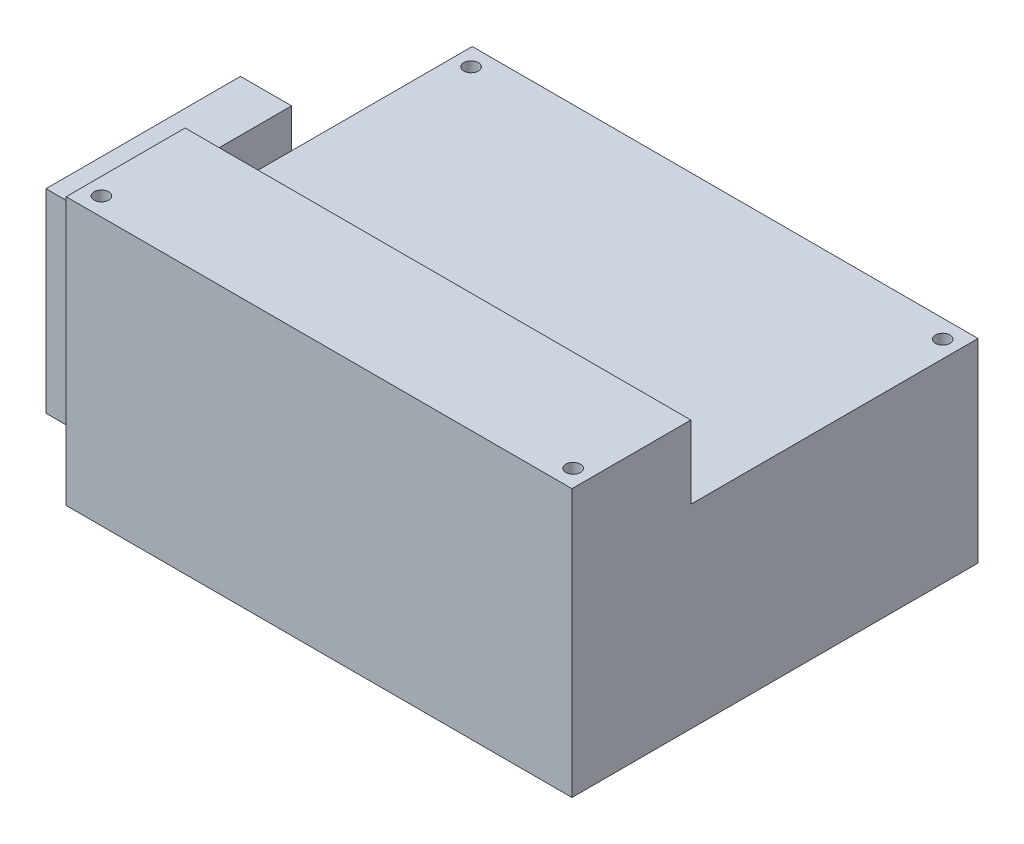
ISO-10303-21;
HEADER;
FILE_DESCRIPTION(('STEP AP214'),'2;1');
FILE_NAME('part.step','',(''),(''),'','','');
FILE_SCHEMA(('AUTOMOTIVE_DESIGN { 1 0 10303 214 1 1 1 1 }'));
ENDSEC;
DATA;
#1=APPLICATION_CONTEXT('core data for automotive mechanical design processes');
#2=APPLICATION_PROTOCOL_DEFINITION('international standard','automotive_design',2000,#1);
#3=PRODUCT_CONTEXT('',#1,'mechanical');
#4=PRODUCT('Part','Part','',(#3));
#5=PRODUCT_RELATED_PRODUCT_CATEGORY('part','',(#4));
#6=PRODUCT_DEFINITION_FORMATION('','',#4);
#7=PRODUCT_DEFINITION_CONTEXT('part definition',#1,'design');
#8=PRODUCT_DEFINITION('design','',#6,#7);
#9=PRODUCT_DEFINITION_SHAPE('','',#8);
#10=(LENGTH_UNIT() NAMED_UNIT(*) SI_UNIT(.MILLI.,.METRE.));
#11=(NAMED_UNIT(*) PLANE_ANGLE_UNIT() SI_UNIT($,.RADIAN.));
#12=(NAMED_UNIT(*) SI_UNIT($,.STERADIAN.) SOLID_ANGLE_UNIT());
#13=UNCERTAINTY_MEASURE_WITH_UNIT(LENGTH_MEASURE(1.E-05),#10,'distance_accuracy_value','');
#14=(GEOMETRIC_REPRESENTATION_CONTEXT(3) GLOBAL_UNCERTAINTY_ASSIGNED_CONTEXT((#13)) GLOBAL_UNIT_ASSIGNED_CONTEXT((#10,
#11,#12)) REPRESENTATION_CONTEXT('',''));
#15=CARTESIAN_POINT('',(0.,0.,0.));
#16=DIRECTION('',(0.,0.,1.));
#17=DIRECTION('',(1.,0.,0.));
#18=AXIS2_PLACEMENT_3D('',#15,#16,#17);
#19=CARTESIAN_POINT('',(0.,55.,0.));
#20=DIRECTION('',(1.,0.,0.));
#21=DIRECTION('',(0.,0.,-1.));
#22=AXIS2_PLACEMENT_3D('',#19,#20,#21);
#23=PLANE('',#22);
#24=DIRECTION('',(0.,-1.,0.));
#25=VECTOR('',#24,1.);
#26=CARTESIAN_POINT('',(0.,8.,-46.35));
#27=LINE('',#26,#25);
#28=CARTESIAN_POINT('',(0.,40.,-46.35));
#29=VERTEX_POINT('',#28);
#30=CARTESIAN_POINT('',(0.,8.,-46.35));
#31=VERTEX_POINT('',#30);
#32=EDGE_CURVE('E11',#29,#31,#27,.T.);
#33=ORIENTED_EDGE('',*,*,#32,.F.);
#34=DIRECTION('',(0.,0.,-1.));
#35=VECTOR('',#34,1.);
#36=CARTESIAN_POINT('',(0.,40.,-83.5));
#37=LINE('',#36,#35);
#38=CARTESIAN_POINT('',(0.,40.,-83.5));
#39=VERTEX_POINT('',#38);
#40=EDGE_CURVE('E164',#29,#39,#37,.T.);
#41=ORIENTED_EDGE('',*,*,#40,.T.);
#42=DIRECTION('',(0.,-1.,0.));
#43=VECTOR('',#42,1.);
#44=CARTESIAN_POINT('',(0.,55.,-83.5));
#45=LINE('',#44,#43);
#46=CARTESIAN_POINT('',(0.,0.,-83.5));
#47=VERTEX_POINT('',#46);
#48=EDGE_CURVE('E190',#39,#47,#45,.T.);
#49=ORIENTED_EDGE('',*,*,#48,.T.);
#50=DIRECTION('',(0.,0.,1.));
#51=VECTOR('',#50,1.);
#52=CARTESIAN_POINT('',(0.,0.,0.));
#53=LINE('',#52,#51);
#54=CARTESIAN_POINT('',(0.,0.,0.));
#55=VERTEX_POINT('',#54);
#56=EDGE_CURVE('E178',#47,#55,#53,.T.);
#57=ORIENTED_EDGE('',*,*,#56,.T.);
#58=DIRECTION('',(0.,-1.,0.));
#59=VECTOR('',#58,1.);
#60=CARTESIAN_POINT('',(0.,55.,0.));
#61=LINE('',#60,#59);
#62=CARTESIAN_POINT('',(0.,55.,0.));
#63=VERTEX_POINT('',#62);
#64=EDGE_CURVE('E40',#63,#55,#61,.T.);
#65=ORIENTED_EDGE('',*,*,#64,.F.);
#66=DIRECTION('',(0.,0.,1.));
#67=VECTOR('',#66,1.);
#68=CARTESIAN_POINT('',(0.,55.,0.));
#69=LINE('',#68,#67);
#70=CARTESIAN_POINT('',(0.,55.,-24.4577912464479));
#71=VERTEX_POINT('',#70);
#72=EDGE_CURVE('E182',#71,#63,#69,.T.);
#73=ORIENTED_EDGE('',*,*,#72,.F.);
#74=DIRECTION('',(0.,-1.,0.));
#75=VECTOR('',#74,1.);
#76=CARTESIAN_POINT('',(0.,55.,-24.4577912464479));
#77=LINE('',#76,#75);
#78=CARTESIAN_POINT('',(0.,48.,-24.4577912464479));
#79=VERTEX_POINT('',#78);
#80=EDGE_CURVE('E162',#71,#79,#77,.T.);
#81=ORIENTED_EDGE('',*,*,#80,.T.);
#82=DIRECTION('',(0.,0.,-1.));
#83=VECTOR('',#82,1.);
#84=CARTESIAN_POINT('',(0.,48.,-46.35));
#85=LINE('',#84,#83);
#86=CARTESIAN_POINT('',(0.,48.,-6.35));
#87=VERTEX_POINT('',#86);
#88=EDGE_CURVE('E49',#87,#79,#85,.T.);
#89=ORIENTED_EDGE('',*,*,#88,.F.);
#90=DIRECTION('',(0.,1.,0.));
#91=VECTOR('',#90,1.);
#92=CARTESIAN_POINT('',(0.,8.,-6.35));
#93=LINE('',#92,#91);
#94=CARTESIAN_POINT('',(0.,8.,-6.35));
#95=VERTEX_POINT('',#94);
#96=EDGE_CURVE('E249',#95,#87,#93,.T.);
#97=ORIENTED_EDGE('',*,*,#96,.F.);
#98=DIRECTION('',(0.,0.,1.));
#99=VECTOR('',#98,1.);
#100=CARTESIAN_POINT('',(0.,8.,-46.35));
#101=LINE('',#100,#99);
#102=EDGE_CURVE('E55',#31,#95,#101,.T.);
#103=ORIENTED_EDGE('',*,*,#102,.F.);
#104=EDGE_LOOP('',(#33,#41,#49,#57,#65,#73,#81,#89,#97,#103));
#105=FACE_BOUND('',#104,.T.);
#106=ADVANCED_FACE('F32',(#105),#23,.F.);
#107=CARTESIAN_POINT('',(0.,55.,0.));
#108=DIRECTION('',(0.,0.,-1.));
#109=DIRECTION('',(-1.,0.,0.));
#110=AXIS2_PLACEMENT_3D('',#107,#108,#109);
#111=PLANE('',#110);
#112=DIRECTION('',(1.,0.,0.));
#113=VECTOR('',#112,1.);
#114=CARTESIAN_POINT('',(0.,0.,0.));
#115=LINE('',#114,#113);
#116=CARTESIAN_POINT('',(104.,0.,0.));
#117=VERTEX_POINT('',#116);
#118=EDGE_CURVE('E193',#55,#117,#115,.T.);
#119=ORIENTED_EDGE('',*,*,#118,.T.);
#120=DIRECTION('',(0.,-1.,0.));
#121=VECTOR('',#120,1.);
#122=CARTESIAN_POINT('',(104.,55.,0.));
#123=LINE('',#122,#121);
#124=CARTESIAN_POINT('',(104.,55.,0.));
#125=VERTEX_POINT('',#124);
#126=EDGE_CURVE('E203',#125,#117,#123,.T.);
#127=ORIENTED_EDGE('',*,*,#126,.F.);
#128=DIRECTION('',(1.,0.,0.));
#129=VECTOR('',#128,1.);
#130=CARTESIAN_POINT('',(0.,55.,0.));
#131=LINE('',#130,#129);
#132=EDGE_CURVE('E184',#63,#125,#131,.T.);
#133=ORIENTED_EDGE('',*,*,#132,.F.);
#134=ORIENTED_EDGE('',*,*,#64,.T.);
#135=EDGE_LOOP('',(#119,#127,#133,#134));
#136=FACE_BOUND('',#135,.T.);
#137=ADVANCED_FACE('F231',(#136),#111,.F.);
#138=CARTESIAN_POINT('',(104.,55.,0.));
#139=DIRECTION('',(-1.,0.,0.));
#140=DIRECTION('',(0.,0.,1.));
#141=AXIS2_PLACEMENT_3D('',#138,#139,#140);
#142=PLANE('',#141);
#143=DIRECTION('',(0.,-1.,0.));
#144=VECTOR('',#143,1.);
#145=CARTESIAN_POINT('',(104.,55.,-83.5));
#146=LINE('',#145,#144);
#147=CARTESIAN_POINT('',(104.,40.,-83.5));
#148=VERTEX_POINT('',#147);
#149=CARTESIAN_POINT('',(104.,0.,-83.5));
#150=VERTEX_POINT('',#149);
#151=EDGE_CURVE('E201',#148,#150,#146,.T.);
#152=ORIENTED_EDGE('',*,*,#151,.F.);
#153=DIRECTION('',(0.,0.,-1.));
#154=VECTOR('',#153,1.);
#155=CARTESIAN_POINT('',(104.,40.,-83.5));
#156=LINE('',#155,#154);
#157=CARTESIAN_POINT('',(104.,40.,-24.4577912464479));
#158=VERTEX_POINT('',#157);
#159=EDGE_CURVE('E173',#158,#148,#156,.T.);
#160=ORIENTED_EDGE('',*,*,#159,.F.);
#161=DIRECTION('',(0.,-1.,0.));
#162=VECTOR('',#161,1.);
#163=CARTESIAN_POINT('',(104.,55.,-24.4577912464479));
#164=LINE('',#163,#162);
#165=CARTESIAN_POINT('',(104.,55.,-24.4577912464479));
#166=VERTEX_POINT('',#165);
#167=EDGE_CURVE('E170',#166,#158,#164,.T.);
#168=ORIENTED_EDGE('',*,*,#167,.F.);
#169=DIRECTION('',(0.,0.,-1.));
#170=VECTOR('',#169,1.);
#171=CARTESIAN_POINT('',(104.,55.,0.));
#172=LINE('',#171,#170);
#173=EDGE_CURVE('E187',#125,#166,#172,.T.);
#174=ORIENTED_EDGE('',*,*,#173,.F.);
#175=ORIENTED_EDGE('',*,*,#126,.T.);
#176=DIRECTION('',(0.,0.,-1.));
#177=VECTOR('',#176,1.);
#178=CARTESIAN_POINT('',(104.,0.,0.));
#179=LINE('',#178,#177);
#180=EDGE_CURVE('E195',#117,#150,#179,.T.);
#181=ORIENTED_EDGE('',*,*,#180,.T.);
#182=EDGE_LOOP('',(#152,#160,#168,#174,#175,#181));
#183=FACE_BOUND('',#182,.T.);
#184=ADVANCED_FACE('F237',(#183),#142,.F.);
#185=CARTESIAN_POINT('',(0.,55.,-83.5));
#186=DIRECTION('',(0.,0.,1.));
#187=DIRECTION('',(1.,0.,0.));
#188=AXIS2_PLACEMENT_3D('',#185,#186,#187);
#189=PLANE('',#188);
#190=ORIENTED_EDGE('',*,*,#48,.F.);
#191=DIRECTION('',(1.,0.,0.));
#192=VECTOR('',#191,1.);
#193=CARTESIAN_POINT('',(0.,40.,-83.5));
#194=LINE('',#193,#192);
#195=EDGE_CURVE('E175',#39,#148,#194,.T.);
#196=ORIENTED_EDGE('',*,*,#195,.T.);
#197=ORIENTED_EDGE('',*,*,#151,.T.);
#198=DIRECTION('',(-1.,0.,0.));
#199=VECTOR('',#198,1.);
#200=CARTESIAN_POINT('',(0.,0.,-83.5));
#201=LINE('',#200,#199);
#202=EDGE_CURVE('E185',#150,#47,#201,.T.);
#203=ORIENTED_EDGE('',*,*,#202,.T.);
#204=EDGE_LOOP('',(#190,#196,#197,#203));
#205=FACE_BOUND('',#204,.T.);
#206=ADVANCED_FACE('F303',(#205),#189,.F.);
#207=CARTESIAN_POINT('',(0.,55.,0.));
#208=DIRECTION('',(0.,-1.,0.));
#209=DIRECTION('',(0.,0.,-1.));
#210=AXIS2_PLACEMENT_3D('',#207,#208,#209);
#211=PLANE('',#210);
#212=CARTESIAN_POINT('',(3.49999999999999,55.,-3.75000000000002));
#213=DIRECTION('',(0.,-1.,0.));
#214=DIRECTION('',(0.,0.,-1.));
#215=AXIS2_PLACEMENT_3D('',#212,#213,#214);
#216=CIRCLE('',#215,1.5);
#217=CARTESIAN_POINT('',(3.49999999999999,55.,-5.25000000000002));
#218=VERTEX_POINT('',#217);
#219=EDGE_CURVE('E147',#218,#218,#216,.T.);
#220=ORIENTED_EDGE('',*,*,#219,.T.);
#221=EDGE_LOOP('',(#220));
#222=FACE_BOUND('',#221,.T.);
#223=CARTESIAN_POINT('',(100.5,55.,-3.75));
#224=DIRECTION('',(0.,-1.,0.));
#225=DIRECTION('',(0.,0.,-1.));
#226=AXIS2_PLACEMENT_3D('',#223,#224,#225);
#227=CIRCLE('',#226,1.5);
#228=CARTESIAN_POINT('',(100.5,55.,-5.25));
#229=VERTEX_POINT('',#228);
#230=EDGE_CURVE('E153',#229,#229,#227,.T.);
#231=ORIENTED_EDGE('',*,*,#230,.T.);
#232=EDGE_LOOP('',(#231));
#233=FACE_BOUND('',#232,.T.);
#234=ORIENTED_EDGE('',*,*,#173,.T.);
#235=DIRECTION('',(1.,0.,0.));
#236=VECTOR('',#235,1.);
#237=CARTESIAN_POINT('',(0.,55.,-24.4577912464479));
#238=LINE('',#237,#236);
#239=EDGE_CURVE('E169',#71,#166,#238,.T.);
#240=ORIENTED_EDGE('',*,*,#239,.F.);
#241=ORIENTED_EDGE('',*,*,#72,.T.);
#242=ORIENTED_EDGE('',*,*,#132,.T.);
#243=EDGE_LOOP('',(#234,#240,#241,#242));
#244=FACE_BOUND('',#243,.T.);
#245=ADVANCED_FACE('F290',(#222,#233,#244),#211,.F.);
#246=CARTESIAN_POINT('',(0.,0.,0.));
#247=DIRECTION('',(0.,-1.,0.));
#248=DIRECTION('',(0.,0.,-1.));
#249=AXIS2_PLACEMENT_3D('',#246,#247,#248);
#250=PLANE('',#249);
#251=CARTESIAN_POINT('',(3.49999999999999,0.,-3.75000000000002));
#252=DIRECTION('',(0.,-1.,0.));
#253=DIRECTION('',(0.,0.,-1.));
#254=AXIS2_PLACEMENT_3D('',#251,#252,#253);
#255=CIRCLE('',#254,1.5);
#256=CARTESIAN_POINT('',(3.49999999999999,0.,-5.25000000000002));
#257=VERTEX_POINT('',#256);
#258=EDGE_CURVE('E150',#257,#257,#255,.T.);
#259=ORIENTED_EDGE('',*,*,#258,.F.);
#260=EDGE_LOOP('',(#259));
#261=FACE_BOUND('',#260,.T.);
#262=CARTESIAN_POINT('',(100.5,0.,-3.75));
#263=DIRECTION('',(0.,-1.,0.));
#264=DIRECTION('',(0.,0.,-1.));
#265=AXIS2_PLACEMENT_3D('',#262,#263,#264);
#266=CIRCLE('',#265,1.5);
#267=CARTESIAN_POINT('',(100.5,0.,-5.25));
#268=VERTEX_POINT('',#267);
#269=EDGE_CURVE('E141',#268,#268,#266,.T.);
#270=ORIENTED_EDGE('',*,*,#269,.F.);
#271=EDGE_LOOP('',(#270));
#272=FACE_BOUND('',#271,.T.);
#273=CARTESIAN_POINT('',(100.5,0.,-79.75));
#274=DIRECTION('',(0.,-1.,0.));
#275=DIRECTION('',(0.,0.,-1.));
#276=AXIS2_PLACEMENT_3D('',#273,#274,#275);
#277=CIRCLE('',#276,1.5);
#278=CARTESIAN_POINT('',(100.5,0.,-81.25));
#279=VERTEX_POINT('',#278);
#280=EDGE_CURVE('E138',#279,#279,#277,.T.);
#281=ORIENTED_EDGE('',*,*,#280,.F.);
#282=EDGE_LOOP('',(#281));
#283=FACE_BOUND('',#282,.T.);
#284=CARTESIAN_POINT('',(3.5,0.,-79.75));
#285=DIRECTION('',(0.,-1.,0.));
#286=DIRECTION('',(0.,0.,-1.));
#287=AXIS2_PLACEMENT_3D('',#284,#285,#286);
#288=CIRCLE('',#287,1.5);
#289=CARTESIAN_POINT('',(3.5,0.,-81.25));
#290=VERTEX_POINT('',#289);
#291=EDGE_CURVE('E158',#290,#290,#288,.T.);
#292=ORIENTED_EDGE('',*,*,#291,.F.);
#293=EDGE_LOOP('',(#292));
#294=FACE_BOUND('',#293,.T.);
#295=ORIENTED_EDGE('',*,*,#56,.F.);
#296=ORIENTED_EDGE('',*,*,#202,.F.);
#297=ORIENTED_EDGE('',*,*,#180,.F.);
#298=ORIENTED_EDGE('',*,*,#118,.F.);
#299=EDGE_LOOP('',(#295,#296,#297,#298));
#300=FACE_BOUND('',#299,.T.);
#301=ADVANCED_FACE('F287',(#261,#272,#283,#294,#300),#250,.T.);
#302=CARTESIAN_POINT('',(0.,40.,-83.5));
#303=DIRECTION('',(0.,-1.,0.));
#304=DIRECTION('',(0.,0.,-1.));
#305=AXIS2_PLACEMENT_3D('',#302,#303,#304);
#306=PLANE('',#305);
#307=CARTESIAN_POINT('',(100.5,40.,-79.75));
#308=DIRECTION('',(0.,-1.,0.));
#309=DIRECTION('',(0.,0.,-1.));
#310=AXIS2_PLACEMENT_3D('',#307,#308,#309);
#311=CIRCLE('',#310,1.5);
#312=CARTESIAN_POINT('',(100.5,40.,-81.25));
#313=VERTEX_POINT('',#312);
#314=EDGE_CURVE('E35',#313,#313,#311,.T.);
#315=ORIENTED_EDGE('',*,*,#314,.T.);
#316=EDGE_LOOP('',(#315));
#317=FACE_BOUND('',#316,.T.);
#318=CARTESIAN_POINT('',(3.5,40.,-79.75));
#319=DIRECTION('',(0.,-1.,0.));
#320=DIRECTION('',(0.,0.,-1.));
#321=AXIS2_PLACEMENT_3D('',#318,#319,#320);
#322=CIRCLE('',#321,1.5);
#323=CARTESIAN_POINT('',(3.5,40.,-81.25));
#324=VERTEX_POINT('',#323);
#325=EDGE_CURVE('E161',#324,#324,#322,.T.);
#326=ORIENTED_EDGE('',*,*,#325,.T.);
#327=EDGE_LOOP('',(#326));
#328=FACE_BOUND('',#327,.T.);
#329=ORIENTED_EDGE('',*,*,#159,.T.);
#330=ORIENTED_EDGE('',*,*,#195,.F.);
#331=ORIENTED_EDGE('',*,*,#40,.F.);
#332=CARTESIAN_POINT('',(0.,40.,-24.4577912464479));
#333=VERTEX_POINT('',#332);
#334=EDGE_CURVE('E166',#333,#29,#37,.T.);
#335=ORIENTED_EDGE('',*,*,#334,.F.);
#336=DIRECTION('',(1.,0.,0.));
#337=VECTOR('',#336,1.);
#338=CARTESIAN_POINT('',(0.,40.,-24.4577912464479));
#339=LINE('',#338,#337);
#340=EDGE_CURVE('E179',#333,#158,#339,.T.);
#341=ORIENTED_EDGE('',*,*,#340,.T.);
#342=EDGE_LOOP('',(#329,#330,#331,#335,#341));
#343=FACE_BOUND('',#342,.T.);
#344=ADVANCED_FACE('F210',(#317,#328,#343),#306,.F.);
#345=CARTESIAN_POINT('',(0.,55.,-24.4577912464479));
#346=DIRECTION('',(0.,0.,1.));
#347=DIRECTION('',(1.,0.,0.));
#348=AXIS2_PLACEMENT_3D('',#345,#346,#347);
#349=PLANE('',#348);
#350=ORIENTED_EDGE('',*,*,#167,.T.);
#351=ORIENTED_EDGE('',*,*,#340,.F.);
#352=EDGE_CURVE('E165',#79,#333,#77,.T.);
#353=ORIENTED_EDGE('',*,*,#352,.F.);
#354=ORIENTED_EDGE('',*,*,#80,.F.);
#355=ORIENTED_EDGE('',*,*,#239,.T.);
#356=EDGE_LOOP('',(#350,#351,#353,#354,#355));
#357=FACE_BOUND('',#356,.T.);
#358=ADVANCED_FACE('F216',(#357),#349,.F.);
#359=CARTESIAN_POINT('',(3.5,55.,-79.75));
#360=DIRECTION('',(0.,-1.,0.));
#361=DIRECTION('',(0.,0.,-1.));
#362=AXIS2_PLACEMENT_3D('',#359,#360,#361);
#363=CYLINDRICAL_SURFACE('',#362,1.5);
#364=ORIENTED_EDGE('',*,*,#291,.T.);
#365=EDGE_LOOP('',(#364));
#366=FACE_BOUND('',#365,.T.);
#367=ORIENTED_EDGE('',*,*,#325,.F.);
#368=EDGE_LOOP('',(#367));
#369=FACE_BOUND('',#368,.T.);
#370=ADVANCED_FACE('F213',(#366,#369),#363,.F.);
#371=CARTESIAN_POINT('',(100.5,55.,-79.75));
#372=DIRECTION('',(0.,-1.,0.));
#373=DIRECTION('',(0.,0.,-1.));
#374=AXIS2_PLACEMENT_3D('',#371,#372,#373);
#375=CYLINDRICAL_SURFACE('',#374,1.5);
#376=ORIENTED_EDGE('',*,*,#280,.T.);
#377=EDGE_LOOP('',(#376));
#378=FACE_BOUND('',#377,.T.);
#379=ORIENTED_EDGE('',*,*,#314,.F.);
#380=EDGE_LOOP('',(#379));
#381=FACE_BOUND('',#380,.T.);
#382=ADVANCED_FACE('F215',(#378,#381),#375,.F.);
#383=CARTESIAN_POINT('',(100.5,55.,-3.75));
#384=DIRECTION('',(0.,-1.,0.));
#385=DIRECTION('',(0.,0.,-1.));
#386=AXIS2_PLACEMENT_3D('',#383,#384,#385);
#387=CYLINDRICAL_SURFACE('',#386,1.5);
#388=ORIENTED_EDGE('',*,*,#230,.F.);
#389=EDGE_LOOP('',(#388));
#390=FACE_BOUND('',#389,.T.);
#391=ORIENTED_EDGE('',*,*,#269,.T.);
#392=EDGE_LOOP('',(#391));
#393=FACE_BOUND('',#392,.T.);
#394=ADVANCED_FACE('F223',(#390,#393),#387,.F.);
#395=CARTESIAN_POINT('',(3.49999999999999,55.,-3.75000000000002));
#396=DIRECTION('',(0.,-1.,0.));
#397=DIRECTION('',(0.,0.,-1.));
#398=AXIS2_PLACEMENT_3D('',#395,#396,#397);
#399=CYLINDRICAL_SURFACE('',#398,1.5);
#400=ORIENTED_EDGE('',*,*,#219,.F.);
#401=EDGE_LOOP('',(#400));
#402=FACE_BOUND('',#401,.T.);
#403=ORIENTED_EDGE('',*,*,#258,.T.);
#404=EDGE_LOOP('',(#403));
#405=FACE_BOUND('',#404,.T.);
#406=ADVANCED_FACE('F275',(#402,#405),#399,.F.);
#407=CARTESIAN_POINT('',(-10.5,8.,-46.35));
#408=DIRECTION('',(0.,0.,1.));
#409=DIRECTION('',(1.,0.,0.));
#410=AXIS2_PLACEMENT_3D('',#407,#408,#409);
#411=PLANE('',#410);
#412=CARTESIAN_POINT('',(0.,48.,-46.35));
#413=VERTEX_POINT('',#412);
#414=EDGE_CURVE('E42',#413,#29,#27,.T.);
#415=ORIENTED_EDGE('',*,*,#414,.T.);
#416=ORIENTED_EDGE('',*,*,#32,.T.);
#417=DIRECTION('',(1.,0.,0.));
#418=VECTOR('',#417,1.);
#419=CARTESIAN_POINT('',(-10.5,8.,-46.35));
#420=LINE('',#419,#418);
#421=CARTESIAN_POINT('',(-10.5,8.,-46.35));
#422=VERTEX_POINT('',#421);
#423=EDGE_CURVE('E120',#422,#31,#420,.T.);
#424=ORIENTED_EDGE('',*,*,#423,.F.);
#425=DIRECTION('',(0.,-1.,0.));
#426=VECTOR('',#425,1.);
#427=CARTESIAN_POINT('',(-10.5,8.,-46.35));
#428=LINE('',#427,#426);
#429=CARTESIAN_POINT('',(-10.5,48.,-46.35));
#430=VERTEX_POINT('',#429);
#431=EDGE_CURVE('E126',#430,#422,#428,.T.);
#432=ORIENTED_EDGE('',*,*,#431,.F.);
#433=DIRECTION('',(1.,0.,0.));
#434=VECTOR('',#433,1.);
#435=CARTESIAN_POINT('',(-10.5,48.,-46.35));
#436=LINE('',#435,#434);
#437=EDGE_CURVE('E248',#430,#413,#436,.T.);
#438=ORIENTED_EDGE('',*,*,#437,.T.);
#439=EDGE_LOOP('',(#415,#416,#424,#432,#438));
#440=FACE_BOUND('',#439,.T.);
#441=ADVANCED_FACE('F137',(#440),#411,.F.);
#442=CARTESIAN_POINT('',(-10.5,8.,-46.35));
#443=DIRECTION('',(0.,1.,0.));
#444=DIRECTION('',(0.,0.,1.));
#445=AXIS2_PLACEMENT_3D('',#442,#443,#444);
#446=PLANE('',#445);
#447=ORIENTED_EDGE('',*,*,#102,.T.);
#448=DIRECTION('',(1.,0.,0.));
#449=VECTOR('',#448,1.);
#450=CARTESIAN_POINT('',(-10.5,8.,-6.35));
#451=LINE('',#450,#449);
#452=CARTESIAN_POINT('',(-10.5,8.,-6.35));
#453=VERTEX_POINT('',#452);
#454=EDGE_CURVE('E122',#453,#95,#451,.T.);
#455=ORIENTED_EDGE('',*,*,#454,.F.);
#456=DIRECTION('',(0.,0.,1.));
#457=VECTOR('',#456,1.);
#458=CARTESIAN_POINT('',(-10.5,8.,-46.35));
#459=LINE('',#458,#457);
#460=EDGE_CURVE('E116',#422,#453,#459,.T.);
#461=ORIENTED_EDGE('',*,*,#460,.F.);
#462=ORIENTED_EDGE('',*,*,#423,.T.);
#463=EDGE_LOOP('',(#447,#455,#461,#462));
#464=FACE_BOUND('',#463,.T.);
#465=ADVANCED_FACE('F118',(#464),#446,.F.);
#466=CARTESIAN_POINT('',(-10.5,8.,-6.35));
#467=DIRECTION('',(0.,0.,-1.));
#468=DIRECTION('',(0.,1.,0.));
#469=AXIS2_PLACEMENT_3D('',#466,#467,#468);
#470=PLANE('',#469);
#471=ORIENTED_EDGE('',*,*,#96,.T.);
#472=DIRECTION('',(1.,0.,0.));
#473=VECTOR('',#472,1.);
#474=CARTESIAN_POINT('',(-10.5,48.,-6.35));
#475=LINE('',#474,#473);
#476=CARTESIAN_POINT('',(-10.5,48.,-6.35));
#477=VERTEX_POINT('',#476);
#478=EDGE_CURVE('E143',#477,#87,#475,.T.);
#479=ORIENTED_EDGE('',*,*,#478,.F.);
#480=DIRECTION('',(0.,1.,0.));
#481=VECTOR('',#480,1.);
#482=CARTESIAN_POINT('',(-10.5,8.,-6.35));
#483=LINE('',#482,#481);
#484=EDGE_CURVE('E125',#453,#477,#483,.T.);
#485=ORIENTED_EDGE('',*,*,#484,.F.);
#486=ORIENTED_EDGE('',*,*,#454,.T.);
#487=EDGE_LOOP('',(#471,#479,#485,#486));
#488=FACE_BOUND('',#487,.T.);
#489=ADVANCED_FACE('F262',(#488),#470,.F.);
#490=CARTESIAN_POINT('',(-10.5,48.,-46.35));
#491=DIRECTION('',(0.,-1.,0.));
#492=DIRECTION('',(0.,0.,-1.));
#493=AXIS2_PLACEMENT_3D('',#490,#491,#492);
#494=PLANE('',#493);
#495=ORIENTED_EDGE('',*,*,#88,.T.);
#496=EDGE_CURVE('E255',#79,#413,#85,.T.);
#497=ORIENTED_EDGE('',*,*,#496,.T.);
#498=ORIENTED_EDGE('',*,*,#437,.F.);
#499=DIRECTION('',(0.,0.,-1.));
#500=VECTOR('',#499,1.);
#501=CARTESIAN_POINT('',(-10.5,48.,-46.35));
#502=LINE('',#501,#500);
#503=EDGE_CURVE('E131',#477,#430,#502,.T.);
#504=ORIENTED_EDGE('',*,*,#503,.F.);
#505=ORIENTED_EDGE('',*,*,#478,.T.);
#506=EDGE_LOOP('',(#495,#497,#498,#504,#505));
#507=FACE_BOUND('',#506,.T.);
#508=ADVANCED_FACE('F260',(#507),#494,.F.);
#509=CARTESIAN_POINT('',(-10.5,0.,0.));
#510=DIRECTION('',(1.,0.,0.));
#511=DIRECTION('',(0.,0.,-1.));
#512=AXIS2_PLACEMENT_3D('',#509,#510,#511);
#513=PLANE('',#512);
#514=ORIENTED_EDGE('',*,*,#431,.T.);
#515=ORIENTED_EDGE('',*,*,#460,.T.);
#516=ORIENTED_EDGE('',*,*,#484,.T.);
#517=ORIENTED_EDGE('',*,*,#503,.T.);
#518=EDGE_LOOP('',(#514,#515,#516,#517));
#519=FACE_BOUND('',#518,.T.);
#520=ADVANCED_FACE('F129',(#519),#513,.F.);
#521=CARTESIAN_POINT('',(0.,0.,0.));
#522=DIRECTION('',(1.,0.,0.));
#523=DIRECTION('',(0.,0.,-1.));
#524=AXIS2_PLACEMENT_3D('',#521,#522,#523);
#525=PLANE('',#524);
#526=ORIENTED_EDGE('',*,*,#496,.F.);
#527=ORIENTED_EDGE('',*,*,#352,.T.);
#528=ORIENTED_EDGE('',*,*,#334,.T.);
#529=ORIENTED_EDGE('',*,*,#414,.F.);
#530=EDGE_LOOP('',(#526,#527,#528,#529));
#531=FACE_BOUND('',#530,.T.);
#532=ADVANCED_FACE('F247',(#531),#525,.T.);
#533=CLOSED_SHELL('',(#106,#137,#184,#206,#245,#301,#344,#358,#370,#382,#394,#406,#441,#465,
#489,#508,#520,#532));
#534=MANIFOLD_SOLID_BREP('B2',#533);
#535=ADVANCED_BREP_SHAPE_REPRESENTATION('',(#18,#534),#14);
#536=SHAPE_DEFINITION_REPRESENTATION(#9,#535);
ENDSEC;
END-ISO-10303-21;
